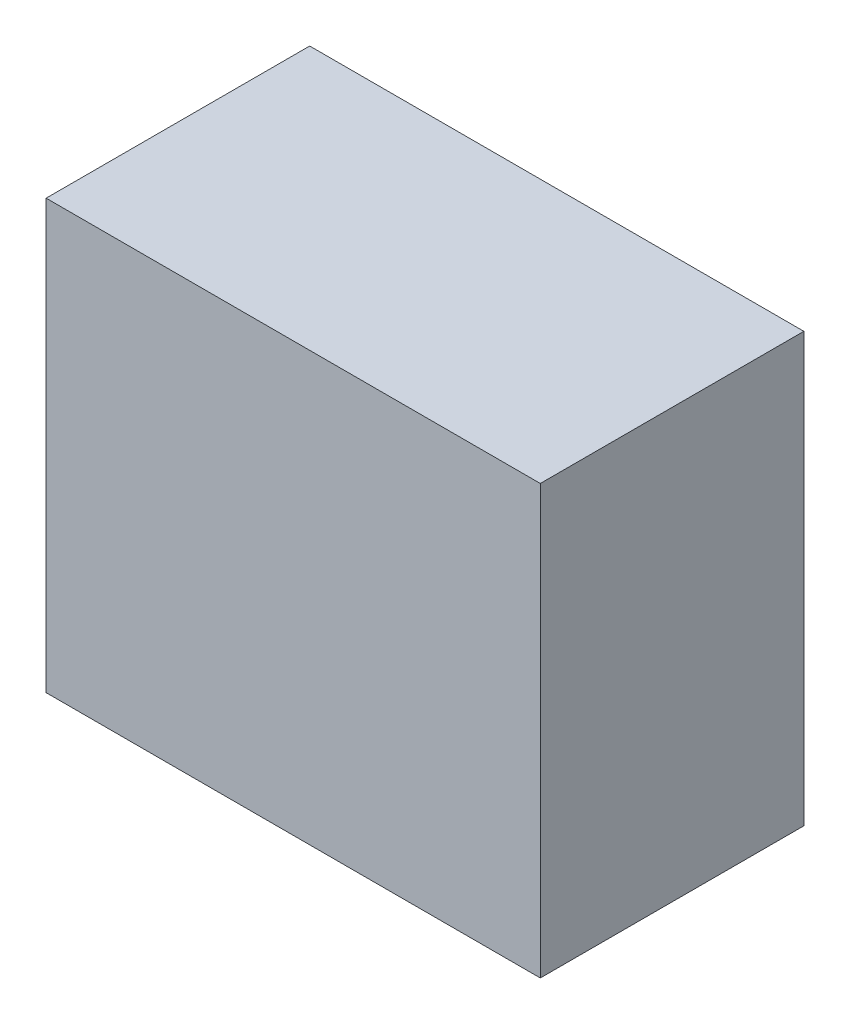
ISO-10303-21;
HEADER;
FILE_DESCRIPTION(('STEP AP214'),'2;1');
FILE_NAME('part.step','',(''),(''),'','','');
FILE_SCHEMA(('AUTOMOTIVE_DESIGN { 1 0 10303 214 1 1 1 1 }'));
ENDSEC;
DATA;
#1=APPLICATION_CONTEXT('core data for automotive mechanical design processes');
#2=APPLICATION_PROTOCOL_DEFINITION('international standard','automotive_design',2000,#1);
#3=PRODUCT_CONTEXT('',#1,'mechanical');
#4=PRODUCT('Part','Part','',(#3));
#5=PRODUCT_RELATED_PRODUCT_CATEGORY('part','',(#4));
#6=PRODUCT_DEFINITION_FORMATION('','',#4);
#7=PRODUCT_DEFINITION_CONTEXT('part definition',#1,'design');
#8=PRODUCT_DEFINITION('design','',#6,#7);
#9=PRODUCT_DEFINITION_SHAPE('','',#8);
#10=(LENGTH_UNIT() NAMED_UNIT(*) SI_UNIT(.MILLI.,.METRE.));
#11=(NAMED_UNIT(*) PLANE_ANGLE_UNIT() SI_UNIT($,.RADIAN.));
#12=(NAMED_UNIT(*) SI_UNIT($,.STERADIAN.) SOLID_ANGLE_UNIT());
#13=UNCERTAINTY_MEASURE_WITH_UNIT(LENGTH_MEASURE(1.E-05),#10,'distance_accuracy_value','');
#14=(GEOMETRIC_REPRESENTATION_CONTEXT(3) GLOBAL_UNCERTAINTY_ASSIGNED_CONTEXT((#13)) GLOBAL_UNIT_ASSIGNED_CONTEXT((#10,
#11,#12)) REPRESENTATION_CONTEXT('',''));
#15=CARTESIAN_POINT('',(0.,0.,0.));
#16=DIRECTION('',(0.,0.,1.));
#17=DIRECTION('',(1.,0.,0.));
#18=AXIS2_PLACEMENT_3D('',#15,#16,#17);
#19=CARTESIAN_POINT('',(-482.171326192233,-309.730519005755,203.2));
#20=DIRECTION('',(-1.,0.,0.));
#21=DIRECTION('',(0.,-1.,0.));
#22=AXIS2_PLACEMENT_3D('',#19,#20,#21);
#23=PLANE('',#22);
#24=DIRECTION('',(0.,1.,0.));
#25=VECTOR('',#24,1.);
#26=CARTESIAN_POINT('',(-482.171326192233,-309.730519005755,0.));
#27=LINE('',#26,#25);
#28=CARTESIAN_POINT('',(-482.171326192233,-309.730519005755,0.));
#29=VERTEX_POINT('',#28);
#30=CARTESIAN_POINT('',(-482.171326192233,20.4694809942447,0.));
#31=VERTEX_POINT('',#30);
#32=EDGE_CURVE('E99',#29,#31,#27,.T.);
#33=ORIENTED_EDGE('',*,*,#32,.T.);
#34=DIRECTION('',(0.,0.,-1.));
#35=VECTOR('',#34,1.);
#36=CARTESIAN_POINT('',(-482.171326192233,20.4694809942447,203.2));
#37=LINE('',#36,#35);
#38=CARTESIAN_POINT('',(-482.171326192233,20.4694809942447,203.2));
#39=VERTEX_POINT('',#38);
#40=EDGE_CURVE('E11',#39,#31,#37,.T.);
#41=ORIENTED_EDGE('',*,*,#40,.F.);
#42=DIRECTION('',(0.,1.,0.));
#43=VECTOR('',#42,1.);
#44=CARTESIAN_POINT('',(-482.171326192233,-309.730519005755,203.2));
#45=LINE('',#44,#43);
#46=CARTESIAN_POINT('',(-482.171326192233,-309.730519005755,203.2));
#47=VERTEX_POINT('',#46);
#48=EDGE_CURVE('E87',#47,#39,#45,.T.);
#49=ORIENTED_EDGE('',*,*,#48,.F.);
#50=DIRECTION('',(0.,0.,-1.));
#51=VECTOR('',#50,1.);
#52=CARTESIAN_POINT('',(-482.171326192233,-309.730519005755,203.2));
#53=LINE('',#52,#51);
#54=EDGE_CURVE('E95',#47,#29,#53,.T.);
#55=ORIENTED_EDGE('',*,*,#54,.T.);
#56=EDGE_LOOP('',(#33,#41,#49,#55));
#57=FACE_BOUND('',#56,.T.);
#58=ADVANCED_FACE('F36',(#57),#23,.F.);
#59=CARTESIAN_POINT('',(-482.171326192233,20.4694809942447,203.2));
#60=DIRECTION('',(0.,-1.,0.));
#61=DIRECTION('',(0.,0.,-1.));
#62=AXIS2_PLACEMENT_3D('',#59,#60,#61);
#63=PLANE('',#62);
#64=DIRECTION('',(-1.,0.,0.));
#65=VECTOR('',#64,1.);
#66=CARTESIAN_POINT('',(-482.171326192233,20.4694809942447,0.));
#67=LINE('',#66,#65);
#68=CARTESIAN_POINT('',(-863.171326192233,20.4694809942447,0.));
#69=VERTEX_POINT('',#68);
#70=EDGE_CURVE('E91',#31,#69,#67,.T.);
#71=ORIENTED_EDGE('',*,*,#70,.T.);
#72=DIRECTION('',(0.,0.,-1.));
#73=VECTOR('',#72,1.);
#74=CARTESIAN_POINT('',(-863.171326192233,20.4694809942447,203.2));
#75=LINE('',#74,#73);
#76=CARTESIAN_POINT('',(-863.171326192233,20.4694809942447,203.2));
#77=VERTEX_POINT('',#76);
#78=EDGE_CURVE('E44',#77,#69,#75,.T.);
#79=ORIENTED_EDGE('',*,*,#78,.F.);
#80=DIRECTION('',(-1.,0.,0.));
#81=VECTOR('',#80,1.);
#82=CARTESIAN_POINT('',(-482.171326192233,20.4694809942447,203.2));
#83=LINE('',#82,#81);
#84=EDGE_CURVE('E82',#39,#77,#83,.T.);
#85=ORIENTED_EDGE('',*,*,#84,.F.);
#86=ORIENTED_EDGE('',*,*,#40,.T.);
#87=EDGE_LOOP('',(#71,#79,#85,#86));
#88=FACE_BOUND('',#87,.T.);
#89=ADVANCED_FACE('F90',(#88),#63,.F.);
#90=CARTESIAN_POINT('',(-863.171326192233,-309.730519005755,203.2));
#91=DIRECTION('',(1.,0.,0.));
#92=DIRECTION('',(0.,0.,-1.));
#93=AXIS2_PLACEMENT_3D('',#90,#91,#92);
#94=PLANE('',#93);
#95=DIRECTION('',(0.,-1.,0.));
#96=VECTOR('',#95,1.);
#97=CARTESIAN_POINT('',(-863.171326192233,-309.730519005755,0.));
#98=LINE('',#97,#96);
#99=CARTESIAN_POINT('',(-863.171326192233,-309.730519005755,0.));
#100=VERTEX_POINT('',#99);
#101=EDGE_CURVE('E69',#69,#100,#98,.T.);
#102=ORIENTED_EDGE('',*,*,#101,.T.);
#103=DIRECTION('',(0.,0.,-1.));
#104=VECTOR('',#103,1.);
#105=CARTESIAN_POINT('',(-863.171326192233,-309.730519005755,203.2));
#106=LINE('',#105,#104);
#107=CARTESIAN_POINT('',(-863.171326192233,-309.730519005755,203.2));
#108=VERTEX_POINT('',#107);
#109=EDGE_CURVE('E92',#108,#100,#106,.T.);
#110=ORIENTED_EDGE('',*,*,#109,.F.);
#111=DIRECTION('',(0.,-1.,0.));
#112=VECTOR('',#111,1.);
#113=CARTESIAN_POINT('',(-863.171326192233,-309.730519005755,203.2));
#114=LINE('',#113,#112);
#115=EDGE_CURVE('E85',#77,#108,#114,.T.);
#116=ORIENTED_EDGE('',*,*,#115,.F.);
#117=ORIENTED_EDGE('',*,*,#78,.T.);
#118=EDGE_LOOP('',(#102,#110,#116,#117));
#119=FACE_BOUND('',#118,.T.);
#120=ADVANCED_FACE('F93',(#119),#94,.F.);
#121=CARTESIAN_POINT('',(-482.171326192233,-309.730519005755,203.2));
#122=DIRECTION('',(0.,1.,0.));
#123=DIRECTION('',(-1.,0.,0.));
#124=AXIS2_PLACEMENT_3D('',#121,#122,#123);
#125=PLANE('',#124);
#126=DIRECTION('',(1.,0.,0.));
#127=VECTOR('',#126,1.);
#128=CARTESIAN_POINT('',(-482.171326192233,-309.730519005755,0.));
#129=LINE('',#128,#127);
#130=EDGE_CURVE('E75',#100,#29,#129,.T.);
#131=ORIENTED_EDGE('',*,*,#130,.T.);
#132=ORIENTED_EDGE('',*,*,#54,.F.);
#133=DIRECTION('',(1.,0.,0.));
#134=VECTOR('',#133,1.);
#135=CARTESIAN_POINT('',(-482.171326192233,-309.730519005755,203.2));
#136=LINE('',#135,#134);
#137=EDGE_CURVE('E52',#108,#47,#136,.T.);
#138=ORIENTED_EDGE('',*,*,#137,.F.);
#139=ORIENTED_EDGE('',*,*,#109,.T.);
#140=EDGE_LOOP('',(#131,#132,#138,#139));
#141=FACE_BOUND('',#140,.T.);
#142=ADVANCED_FACE('F106',(#141),#125,.F.);
#143=CARTESIAN_POINT('',(0.,0.,203.2));
#144=DIRECTION('',(0.,0.,1.));
#145=DIRECTION('',(1.,0.,0.));
#146=AXIS2_PLACEMENT_3D('',#143,#144,#145);
#147=PLANE('',#146);
#148=ORIENTED_EDGE('',*,*,#48,.T.);
#149=ORIENTED_EDGE('',*,*,#84,.T.);
#150=ORIENTED_EDGE('',*,*,#115,.T.);
#151=ORIENTED_EDGE('',*,*,#137,.T.);
#152=EDGE_LOOP('',(#148,#149,#150,#151));
#153=FACE_BOUND('',#152,.T.);
#154=ADVANCED_FACE('F83',(#153),#147,.T.);
#155=CARTESIAN_POINT('',(0.,0.,0.));
#156=DIRECTION('',(0.,0.,1.));
#157=DIRECTION('',(1.,0.,0.));
#158=AXIS2_PLACEMENT_3D('',#155,#156,#157);
#159=PLANE('',#158);
#160=ORIENTED_EDGE('',*,*,#32,.F.);
#161=ORIENTED_EDGE('',*,*,#130,.F.);
#162=ORIENTED_EDGE('',*,*,#101,.F.);
#163=ORIENTED_EDGE('',*,*,#70,.F.);
#164=EDGE_LOOP('',(#160,#161,#162,#163));
#165=FACE_BOUND('',#164,.T.);
#166=ADVANCED_FACE('F109',(#165),#159,.F.);
#167=CLOSED_SHELL('',(#58,#89,#120,#142,#154,#166));
#168=MANIFOLD_SOLID_BREP('B2',#167);
#169=ADVANCED_BREP_SHAPE_REPRESENTATION('',(#18,#168),#14);
#170=SHAPE_DEFINITION_REPRESENTATION(#9,#169);
ENDSEC;
END-ISO-10303-21;
